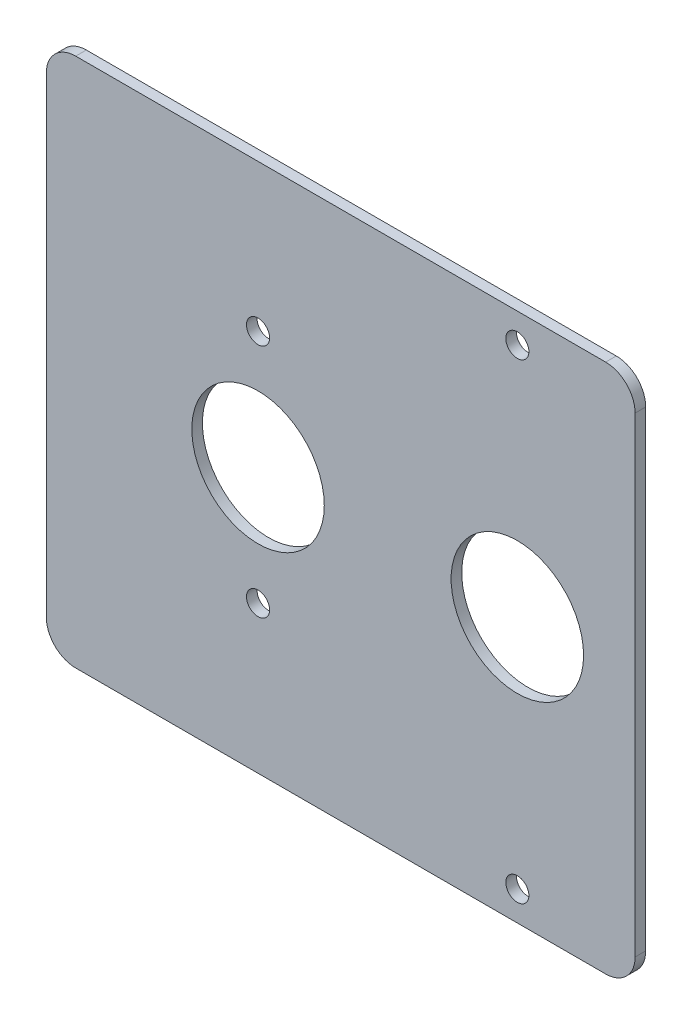
ISO-10303-21;
HEADER;
FILE_DESCRIPTION(('STEP AP214'),'2;1');
FILE_NAME('part.step','',(''),(''),'','','');
FILE_SCHEMA(('AUTOMOTIVE_DESIGN { 1 0 10303 214 1 1 1 1 }'));
ENDSEC;
DATA;
#1=APPLICATION_CONTEXT('core data for automotive mechanical design processes');
#2=APPLICATION_PROTOCOL_DEFINITION('international standard','automotive_design',2000,#1);
#3=PRODUCT_CONTEXT('',#1,'mechanical');
#4=PRODUCT('Part','Part','',(#3));
#5=PRODUCT_RELATED_PRODUCT_CATEGORY('part','',(#4));
#6=PRODUCT_DEFINITION_FORMATION('','',#4);
#7=PRODUCT_DEFINITION_CONTEXT('part definition',#1,'design');
#8=PRODUCT_DEFINITION('design','',#6,#7);
#9=PRODUCT_DEFINITION_SHAPE('','',#8);
#10=(LENGTH_UNIT() NAMED_UNIT(*) SI_UNIT(.MILLI.,.METRE.));
#11=(NAMED_UNIT(*) PLANE_ANGLE_UNIT() SI_UNIT($,.RADIAN.));
#12=(NAMED_UNIT(*) SI_UNIT($,.STERADIAN.) SOLID_ANGLE_UNIT());
#13=UNCERTAINTY_MEASURE_WITH_UNIT(LENGTH_MEASURE(1.E-05),#10,'distance_accuracy_value','');
#14=(GEOMETRIC_REPRESENTATION_CONTEXT(3) GLOBAL_UNCERTAINTY_ASSIGNED_CONTEXT((#13)) GLOBAL_UNIT_ASSIGNED_CONTEXT((#10,
#11,#12)) REPRESENTATION_CONTEXT('',''));
#15=CARTESIAN_POINT('',(0.,0.,0.));
#16=DIRECTION('',(0.,0.,1.));
#17=DIRECTION('',(1.,0.,0.));
#18=AXIS2_PLACEMENT_3D('',#15,#16,#17);
#19=CARTESIAN_POINT('',(0.,0.,1.143));
#20=DIRECTION('',(0.,0.,-1.));
#21=DIRECTION('',(-1.,0.,0.));
#22=AXIS2_PLACEMENT_3D('',#19,#20,#21);
#23=PLANE('',#22);
#24=CARTESIAN_POINT('',(101.6,57.15,1.143));
#25=DIRECTION('',(0.,0.,1.));
#26=DIRECTION('',(1.,0.,0.));
#27=AXIS2_PLACEMENT_3D('',#24,#25,#26);
#28=CIRCLE('',#27,14.2875);
#29=CARTESIAN_POINT('',(115.8875,57.15,1.143));
#30=VERTEX_POINT('',#29);
#31=EDGE_CURVE('E195',#30,#30,#28,.T.);
#32=ORIENTED_EDGE('',*,*,#31,.F.);
#33=EDGE_LOOP('',(#32));
#34=FACE_BOUND('',#33,.T.);
#35=CARTESIAN_POINT('',(45.6692,31.75,1.143));
#36=DIRECTION('',(0.,0.,1.));
#37=DIRECTION('',(1.,0.,0.));
#38=AXIS2_PLACEMENT_3D('',#35,#36,#37);
#39=CIRCLE('',#38,2.4892);
#40=CARTESIAN_POINT('',(48.1584,31.75,1.143));
#41=VERTEX_POINT('',#40);
#42=EDGE_CURVE('E183',#41,#41,#39,.T.);
#43=ORIENTED_EDGE('',*,*,#42,.F.);
#44=EDGE_LOOP('',(#43));
#45=FACE_BOUND('',#44,.T.);
#46=CARTESIAN_POINT('',(45.6692,82.55,1.143));
#47=DIRECTION('',(0.,0.,1.));
#48=DIRECTION('',(1.,0.,0.));
#49=AXIS2_PLACEMENT_3D('',#46,#47,#48);
#50=CIRCLE('',#49,2.4892);
#51=CARTESIAN_POINT('',(48.1584,82.55,1.143));
#52=VERTEX_POINT('',#51);
#53=EDGE_CURVE('E166',#52,#52,#50,.T.);
#54=ORIENTED_EDGE('',*,*,#53,.F.);
#55=EDGE_LOOP('',(#54));
#56=FACE_BOUND('',#55,.T.);
#57=DIRECTION('',(0.,1.,0.));
#58=VECTOR('',#57,1.);
#59=CARTESIAN_POINT('',(127.,0.,1.143));
#60=LINE('',#59,#58);
#61=CARTESIAN_POINT('',(127.,6.35,1.143));
#62=VERTEX_POINT('',#61);
#63=CARTESIAN_POINT('',(127.,107.95,1.143));
#64=VERTEX_POINT('',#63);
#65=EDGE_CURVE('E173',#62,#64,#60,.T.);
#66=ORIENTED_EDGE('',*,*,#65,.T.);
#67=CARTESIAN_POINT('',(120.65,107.95,1.143));
#68=DIRECTION('',(0.,0.,-1.));
#69=DIRECTION('',(-1.,0.,0.));
#70=AXIS2_PLACEMENT_3D('',#67,#68,#69);
#71=CIRCLE('',#70,6.35);
#72=CARTESIAN_POINT('',(120.65,114.3,1.143));
#73=VERTEX_POINT('',#72);
#74=EDGE_CURVE('E150',#64,#73,#71,.F.);
#75=ORIENTED_EDGE('',*,*,#74,.T.);
#76=DIRECTION('',(-1.,0.,0.));
#77=VECTOR('',#76,1.);
#78=CARTESIAN_POINT('',(0.,114.3,1.143));
#79=LINE('',#78,#77);
#80=CARTESIAN_POINT('',(6.35,114.3,1.143));
#81=VERTEX_POINT('',#80);
#82=EDGE_CURVE('E121',#73,#81,#79,.T.);
#83=ORIENTED_EDGE('',*,*,#82,.T.);
#84=CARTESIAN_POINT('',(6.35,107.95,1.143));
#85=DIRECTION('',(0.,0.,-1.));
#86=DIRECTION('',(-1.,0.,0.));
#87=AXIS2_PLACEMENT_3D('',#84,#85,#86);
#88=CIRCLE('',#87,6.35);
#89=CARTESIAN_POINT('',(0.,107.95,1.143));
#90=VERTEX_POINT('',#89);
#91=EDGE_CURVE('E145',#81,#90,#88,.F.);
#92=ORIENTED_EDGE('',*,*,#91,.T.);
#93=DIRECTION('',(0.,-1.,0.));
#94=VECTOR('',#93,1.);
#95=CARTESIAN_POINT('',(0.,0.,1.143));
#96=LINE('',#95,#94);
#97=CARTESIAN_POINT('',(0.,6.35,1.143));
#98=VERTEX_POINT('',#97);
#99=EDGE_CURVE('E128',#90,#98,#96,.T.);
#100=ORIENTED_EDGE('',*,*,#99,.T.);
#101=CARTESIAN_POINT('',(6.35,6.35,1.143));
#102=DIRECTION('',(0.,0.,-1.));
#103=DIRECTION('',(-1.,0.,0.));
#104=AXIS2_PLACEMENT_3D('',#101,#102,#103);
#105=CIRCLE('',#104,6.35);
#106=CARTESIAN_POINT('',(6.35,0.,1.143));
#107=VERTEX_POINT('',#106);
#108=EDGE_CURVE('E57',#98,#107,#105,.F.);
#109=ORIENTED_EDGE('',*,*,#108,.T.);
#110=DIRECTION('',(1.,0.,0.));
#111=VECTOR('',#110,1.);
#112=CARTESIAN_POINT('',(0.,0.,1.143));
#113=LINE('',#112,#111);
#114=CARTESIAN_POINT('',(120.65,0.,1.143));
#115=VERTEX_POINT('',#114);
#116=EDGE_CURVE('E131',#107,#115,#113,.T.);
#117=ORIENTED_EDGE('',*,*,#116,.T.);
#118=CARTESIAN_POINT('',(120.65,6.35,1.143));
#119=DIRECTION('',(0.,0.,-1.));
#120=DIRECTION('',(-1.,0.,0.));
#121=AXIS2_PLACEMENT_3D('',#118,#119,#120);
#122=CIRCLE('',#121,6.35);
#123=EDGE_CURVE('E148',#115,#62,#122,.F.);
#124=ORIENTED_EDGE('',*,*,#123,.T.);
#125=EDGE_LOOP('',(#66,#75,#83,#92,#100,#109,#117,#124));
#126=FACE_BOUND('',#125,.T.);
#127=CARTESIAN_POINT('',(45.6692,57.15,1.143));
#128=DIRECTION('',(0.,0.,1.));
#129=DIRECTION('',(1.,0.,0.));
#130=AXIS2_PLACEMENT_3D('',#127,#128,#129);
#131=CIRCLE('',#130,14.2875);
#132=CARTESIAN_POINT('',(59.9567,57.15,1.143));
#133=VERTEX_POINT('',#132);
#134=EDGE_CURVE('E178',#133,#133,#131,.T.);
#135=ORIENTED_EDGE('',*,*,#134,.F.);
#136=EDGE_LOOP('',(#135));
#137=FACE_BOUND('',#136,.T.);
#138=CARTESIAN_POINT('',(101.6,107.95,1.143));
#139=DIRECTION('',(0.,0.,1.));
#140=DIRECTION('',(1.,0.,0.));
#141=AXIS2_PLACEMENT_3D('',#138,#139,#140);
#142=CIRCLE('',#141,2.4892);
#143=CARTESIAN_POINT('',(104.0892,107.95,1.143));
#144=VERTEX_POINT('',#143);
#145=EDGE_CURVE('E189',#144,#144,#142,.T.);
#146=ORIENTED_EDGE('',*,*,#145,.F.);
#147=EDGE_LOOP('',(#146));
#148=FACE_BOUND('',#147,.T.);
#149=CARTESIAN_POINT('',(101.6,6.35000000000003,1.143));
#150=DIRECTION('',(0.,0.,1.));
#151=DIRECTION('',(1.,0.,0.));
#152=AXIS2_PLACEMENT_3D('',#149,#150,#151);
#153=CIRCLE('',#152,2.4892);
#154=CARTESIAN_POINT('',(104.0892,6.35000000000003,1.143));
#155=VERTEX_POINT('',#154);
#156=EDGE_CURVE('E201',#155,#155,#153,.T.);
#157=ORIENTED_EDGE('',*,*,#156,.F.);
#158=EDGE_LOOP('',(#157));
#159=FACE_BOUND('',#158,.T.);
#160=ADVANCED_FACE('F35',(#34,#45,#56,#126,#137,#148,#159),#23,.F.);
#161=CARTESIAN_POINT('',(0.,0.,-1.143));
#162=DIRECTION('',(0.,0.,-1.));
#163=DIRECTION('',(-1.,0.,0.));
#164=AXIS2_PLACEMENT_3D('',#161,#162,#163);
#165=PLANE('',#164);
#166=CARTESIAN_POINT('',(101.6,57.15,-1.143));
#167=DIRECTION('',(0.,0.,1.));
#168=DIRECTION('',(1.,0.,0.));
#169=AXIS2_PLACEMENT_3D('',#166,#167,#168);
#170=CIRCLE('',#169,14.2875);
#171=CARTESIAN_POINT('',(115.8875,57.15,-1.143));
#172=VERTEX_POINT('',#171);
#173=EDGE_CURVE('E198',#172,#172,#170,.T.);
#174=ORIENTED_EDGE('',*,*,#173,.T.);
#175=EDGE_LOOP('',(#174));
#176=FACE_BOUND('',#175,.T.);
#177=CARTESIAN_POINT('',(45.6692,31.75,-1.143));
#178=DIRECTION('',(0.,0.,1.));
#179=DIRECTION('',(1.,0.,0.));
#180=AXIS2_PLACEMENT_3D('',#177,#178,#179);
#181=CIRCLE('',#180,2.4892);
#182=CARTESIAN_POINT('',(48.1584,31.75,-1.143));
#183=VERTEX_POINT('',#182);
#184=EDGE_CURVE('E186',#183,#183,#181,.T.);
#185=ORIENTED_EDGE('',*,*,#184,.T.);
#186=EDGE_LOOP('',(#185));
#187=FACE_BOUND('',#186,.T.);
#188=CARTESIAN_POINT('',(45.6692,82.55,-1.143));
#189=DIRECTION('',(0.,0.,1.));
#190=DIRECTION('',(1.,0.,0.));
#191=AXIS2_PLACEMENT_3D('',#188,#189,#190);
#192=CIRCLE('',#191,2.4892);
#193=CARTESIAN_POINT('',(48.1584,82.55,-1.143));
#194=VERTEX_POINT('',#193);
#195=EDGE_CURVE('E169',#194,#194,#192,.T.);
#196=ORIENTED_EDGE('',*,*,#195,.T.);
#197=EDGE_LOOP('',(#196));
#198=FACE_BOUND('',#197,.T.);
#199=DIRECTION('',(-1.,0.,0.));
#200=VECTOR('',#199,1.);
#201=CARTESIAN_POINT('',(0.,114.3,-1.143));
#202=LINE('',#201,#200);
#203=CARTESIAN_POINT('',(120.65,114.3,-1.143));
#204=VERTEX_POINT('',#203);
#205=CARTESIAN_POINT('',(6.35,114.3,-1.143));
#206=VERTEX_POINT('',#205);
#207=EDGE_CURVE('E118',#204,#206,#202,.T.);
#208=ORIENTED_EDGE('',*,*,#207,.F.);
#209=CARTESIAN_POINT('',(120.65,107.95,-1.143));
#210=DIRECTION('',(0.,0.,-1.));
#211=DIRECTION('',(-1.,0.,0.));
#212=AXIS2_PLACEMENT_3D('',#209,#210,#211);
#213=CIRCLE('',#212,6.35);
#214=CARTESIAN_POINT('',(127.,107.95,-1.143));
#215=VERTEX_POINT('',#214);
#216=EDGE_CURVE('E101',#204,#215,#213,.T.);
#217=ORIENTED_EDGE('',*,*,#216,.T.);
#218=DIRECTION('',(0.,1.,0.));
#219=VECTOR('',#218,1.);
#220=CARTESIAN_POINT('',(127.,0.,-1.143));
#221=LINE('',#220,#219);
#222=CARTESIAN_POINT('',(127.,6.35,-1.143));
#223=VERTEX_POINT('',#222);
#224=EDGE_CURVE('E129',#223,#215,#221,.T.);
#225=ORIENTED_EDGE('',*,*,#224,.F.);
#226=CARTESIAN_POINT('',(120.65,6.35,-1.143));
#227=DIRECTION('',(0.,0.,-1.));
#228=DIRECTION('',(-1.,0.,0.));
#229=AXIS2_PLACEMENT_3D('',#226,#227,#228);
#230=CIRCLE('',#229,6.35);
#231=CARTESIAN_POINT('',(120.65,0.,-1.143));
#232=VERTEX_POINT('',#231);
#233=EDGE_CURVE('E112',#223,#232,#230,.T.);
#234=ORIENTED_EDGE('',*,*,#233,.T.);
#235=DIRECTION('',(1.,0.,0.));
#236=VECTOR('',#235,1.);
#237=CARTESIAN_POINT('',(0.,0.,-1.143));
#238=LINE('',#237,#236);
#239=CARTESIAN_POINT('',(6.35,0.,-1.143));
#240=VERTEX_POINT('',#239);
#241=EDGE_CURVE('E133',#240,#232,#238,.T.);
#242=ORIENTED_EDGE('',*,*,#241,.F.);
#243=CARTESIAN_POINT('',(6.35,6.35,-1.143));
#244=DIRECTION('',(0.,0.,-1.));
#245=DIRECTION('',(-1.,0.,0.));
#246=AXIS2_PLACEMENT_3D('',#243,#244,#245);
#247=CIRCLE('',#246,6.35);
#248=CARTESIAN_POINT('',(0.,6.35,-1.143));
#249=VERTEX_POINT('',#248);
#250=EDGE_CURVE('E139',#240,#249,#247,.T.);
#251=ORIENTED_EDGE('',*,*,#250,.T.);
#252=DIRECTION('',(0.,-1.,0.));
#253=VECTOR('',#252,1.);
#254=CARTESIAN_POINT('',(0.,0.,-1.143));
#255=LINE('',#254,#253);
#256=CARTESIAN_POINT('',(0.,107.95,-1.143));
#257=VERTEX_POINT('',#256);
#258=EDGE_CURVE('E161',#257,#249,#255,.T.);
#259=ORIENTED_EDGE('',*,*,#258,.F.);
#260=CARTESIAN_POINT('',(6.35,107.95,-1.143));
#261=DIRECTION('',(0.,0.,-1.));
#262=DIRECTION('',(-1.,0.,0.));
#263=AXIS2_PLACEMENT_3D('',#260,#261,#262);
#264=CIRCLE('',#263,6.35);
#265=EDGE_CURVE('E122',#257,#206,#264,.T.);
#266=ORIENTED_EDGE('',*,*,#265,.T.);
#267=EDGE_LOOP('',(#208,#217,#225,#234,#242,#251,#259,#266));
#268=FACE_BOUND('',#267,.T.);
#269=CARTESIAN_POINT('',(45.6692,57.15,-1.143));
#270=DIRECTION('',(0.,0.,1.));
#271=DIRECTION('',(1.,0.,0.));
#272=AXIS2_PLACEMENT_3D('',#269,#270,#271);
#273=CIRCLE('',#272,14.2875);
#274=CARTESIAN_POINT('',(59.9567,57.15,-1.143));
#275=VERTEX_POINT('',#274);
#276=EDGE_CURVE('E180',#275,#275,#273,.T.);
#277=ORIENTED_EDGE('',*,*,#276,.T.);
#278=EDGE_LOOP('',(#277));
#279=FACE_BOUND('',#278,.T.);
#280=CARTESIAN_POINT('',(101.6,107.95,-1.143));
#281=DIRECTION('',(0.,0.,1.));
#282=DIRECTION('',(1.,0.,0.));
#283=AXIS2_PLACEMENT_3D('',#280,#281,#282);
#284=CIRCLE('',#283,2.4892);
#285=CARTESIAN_POINT('',(104.0892,107.95,-1.143));
#286=VERTEX_POINT('',#285);
#287=EDGE_CURVE('E192',#286,#286,#284,.T.);
#288=ORIENTED_EDGE('',*,*,#287,.T.);
#289=EDGE_LOOP('',(#288));
#290=FACE_BOUND('',#289,.T.);
#291=CARTESIAN_POINT('',(101.6,6.35000000000003,-1.143));
#292=DIRECTION('',(0.,0.,1.));
#293=DIRECTION('',(1.,0.,0.));
#294=AXIS2_PLACEMENT_3D('',#291,#292,#293);
#295=CIRCLE('',#294,2.4892);
#296=CARTESIAN_POINT('',(104.0892,6.35000000000003,-1.143));
#297=VERTEX_POINT('',#296);
#298=EDGE_CURVE('E204',#297,#297,#295,.T.);
#299=ORIENTED_EDGE('',*,*,#298,.T.);
#300=EDGE_LOOP('',(#299));
#301=FACE_BOUND('',#300,.T.);
#302=ADVANCED_FACE('F125',(#176,#187,#198,#268,#279,#290,#301),#165,.T.);
#303=CARTESIAN_POINT('',(0.,0.,1.143));
#304=DIRECTION('',(1.,0.,0.));
#305=DIRECTION('',(0.,0.,-1.));
#306=AXIS2_PLACEMENT_3D('',#303,#304,#305);
#307=PLANE('',#306);
#308=ORIENTED_EDGE('',*,*,#258,.T.);
#309=DIRECTION('',(0.,0.,-1.));
#310=VECTOR('',#309,1.);
#311=CARTESIAN_POINT('',(0.,6.35,1.143));
#312=LINE('',#311,#310);
#313=EDGE_CURVE('E11',#249,#98,#312,.F.);
#314=ORIENTED_EDGE('',*,*,#313,.T.);
#315=ORIENTED_EDGE('',*,*,#99,.F.);
#316=DIRECTION('',(0.,0.,-1.));
#317=VECTOR('',#316,1.);
#318=CARTESIAN_POINT('',(0.,107.95,1.143));
#319=LINE('',#318,#317);
#320=EDGE_CURVE('E43',#90,#257,#319,.T.);
#321=ORIENTED_EDGE('',*,*,#320,.T.);
#322=EDGE_LOOP('',(#308,#314,#315,#321));
#323=FACE_BOUND('',#322,.T.);
#324=ADVANCED_FACE('F160',(#323),#307,.F.);
#325=CARTESIAN_POINT('',(0.,0.,1.143));
#326=DIRECTION('',(0.,1.,0.));
#327=DIRECTION('',(0.,0.,1.));
#328=AXIS2_PLACEMENT_3D('',#325,#326,#327);
#329=PLANE('',#328);
#330=ORIENTED_EDGE('',*,*,#241,.T.);
#331=DIRECTION('',(0.,0.,-1.));
#332=VECTOR('',#331,1.);
#333=CARTESIAN_POINT('',(120.65,0.,1.143));
#334=LINE('',#333,#332);
#335=EDGE_CURVE('E50',#232,#115,#334,.F.);
#336=ORIENTED_EDGE('',*,*,#335,.T.);
#337=ORIENTED_EDGE('',*,*,#116,.F.);
#338=DIRECTION('',(0.,0.,-1.));
#339=VECTOR('',#338,1.);
#340=CARTESIAN_POINT('',(6.35,0.,1.143));
#341=LINE('',#340,#339);
#342=EDGE_CURVE('E152',#107,#240,#341,.T.);
#343=ORIENTED_EDGE('',*,*,#342,.T.);
#344=EDGE_LOOP('',(#330,#336,#337,#343));
#345=FACE_BOUND('',#344,.T.);
#346=ADVANCED_FACE('F232',(#345),#329,.F.);
#347=CARTESIAN_POINT('',(127.,0.,1.143));
#348=DIRECTION('',(-1.,0.,0.));
#349=DIRECTION('',(0.,0.,1.));
#350=AXIS2_PLACEMENT_3D('',#347,#348,#349);
#351=PLANE('',#350);
#352=ORIENTED_EDGE('',*,*,#224,.T.);
#353=DIRECTION('',(0.,0.,-1.));
#354=VECTOR('',#353,1.);
#355=CARTESIAN_POINT('',(127.,107.95,1.143));
#356=LINE('',#355,#354);
#357=EDGE_CURVE('E106',#215,#64,#356,.F.);
#358=ORIENTED_EDGE('',*,*,#357,.T.);
#359=ORIENTED_EDGE('',*,*,#65,.F.);
#360=DIRECTION('',(0.,0.,-1.));
#361=VECTOR('',#360,1.);
#362=CARTESIAN_POINT('',(127.,6.35,1.143));
#363=LINE('',#362,#361);
#364=EDGE_CURVE('E111',#62,#223,#363,.T.);
#365=ORIENTED_EDGE('',*,*,#364,.T.);
#366=EDGE_LOOP('',(#352,#358,#359,#365));
#367=FACE_BOUND('',#366,.T.);
#368=ADVANCED_FACE('F229',(#367),#351,.F.);
#369=CARTESIAN_POINT('',(0.,114.3,1.143));
#370=DIRECTION('',(0.,-1.,0.));
#371=DIRECTION('',(0.,0.,-1.));
#372=AXIS2_PLACEMENT_3D('',#369,#370,#371);
#373=PLANE('',#372);
#374=ORIENTED_EDGE('',*,*,#82,.F.);
#375=DIRECTION('',(0.,0.,-1.));
#376=VECTOR('',#375,1.);
#377=CARTESIAN_POINT('',(120.65,114.3,1.143));
#378=LINE('',#377,#376);
#379=EDGE_CURVE('E105',#73,#204,#378,.T.);
#380=ORIENTED_EDGE('',*,*,#379,.T.);
#381=ORIENTED_EDGE('',*,*,#207,.T.);
#382=DIRECTION('',(0.,0.,-1.));
#383=VECTOR('',#382,1.);
#384=CARTESIAN_POINT('',(6.35,114.3,1.143));
#385=LINE('',#384,#383);
#386=EDGE_CURVE('E123',#206,#81,#385,.F.);
#387=ORIENTED_EDGE('',*,*,#386,.T.);
#388=EDGE_LOOP('',(#374,#380,#381,#387));
#389=FACE_BOUND('',#388,.T.);
#390=ADVANCED_FACE('F117',(#389),#373,.F.);
#391=CARTESIAN_POINT('',(45.6692,82.55,1.143));
#392=DIRECTION('',(0.,0.,-1.));
#393=DIRECTION('',(-1.,0.,0.));
#394=AXIS2_PLACEMENT_3D('',#391,#392,#393);
#395=CYLINDRICAL_SURFACE('',#394,2.4892);
#396=ORIENTED_EDGE('',*,*,#53,.T.);
#397=EDGE_LOOP('',(#396));
#398=FACE_BOUND('',#397,.T.);
#399=ORIENTED_EDGE('',*,*,#195,.F.);
#400=EDGE_LOOP('',(#399));
#401=FACE_BOUND('',#400,.T.);
#402=ADVANCED_FACE('F224',(#398,#401),#395,.F.);
#403=CARTESIAN_POINT('',(45.6692,57.15,1.143));
#404=DIRECTION('',(0.,0.,-1.));
#405=DIRECTION('',(-1.,0.,0.));
#406=AXIS2_PLACEMENT_3D('',#403,#404,#405);
#407=CYLINDRICAL_SURFACE('',#406,14.2875);
#408=ORIENTED_EDGE('',*,*,#134,.T.);
#409=EDGE_LOOP('',(#408));
#410=FACE_BOUND('',#409,.T.);
#411=ORIENTED_EDGE('',*,*,#276,.F.);
#412=EDGE_LOOP('',(#411));
#413=FACE_BOUND('',#412,.T.);
#414=ADVANCED_FACE('F277',(#410,#413),#407,.F.);
#415=CARTESIAN_POINT('',(45.6692,31.75,1.143));
#416=DIRECTION('',(0.,0.,-1.));
#417=DIRECTION('',(-1.,0.,0.));
#418=AXIS2_PLACEMENT_3D('',#415,#416,#417);
#419=CYLINDRICAL_SURFACE('',#418,2.4892);
#420=ORIENTED_EDGE('',*,*,#42,.T.);
#421=EDGE_LOOP('',(#420));
#422=FACE_BOUND('',#421,.T.);
#423=ORIENTED_EDGE('',*,*,#184,.F.);
#424=EDGE_LOOP('',(#423));
#425=FACE_BOUND('',#424,.T.);
#426=ADVANCED_FACE('F262',(#422,#425),#419,.F.);
#427=CARTESIAN_POINT('',(101.6,107.95,1.143));
#428=DIRECTION('',(0.,0.,-1.));
#429=DIRECTION('',(-1.,0.,0.));
#430=AXIS2_PLACEMENT_3D('',#427,#428,#429);
#431=CYLINDRICAL_SURFACE('',#430,2.4892);
#432=ORIENTED_EDGE('',*,*,#145,.T.);
#433=EDGE_LOOP('',(#432));
#434=FACE_BOUND('',#433,.T.);
#435=ORIENTED_EDGE('',*,*,#287,.F.);
#436=EDGE_LOOP('',(#435));
#437=FACE_BOUND('',#436,.T.);
#438=ADVANCED_FACE('F258',(#434,#437),#431,.F.);
#439=CARTESIAN_POINT('',(101.6,57.15,1.143));
#440=DIRECTION('',(0.,0.,-1.));
#441=DIRECTION('',(-1.,0.,0.));
#442=AXIS2_PLACEMENT_3D('',#439,#440,#441);
#443=CYLINDRICAL_SURFACE('',#442,14.2875);
#444=ORIENTED_EDGE('',*,*,#31,.T.);
#445=EDGE_LOOP('',(#444));
#446=FACE_BOUND('',#445,.T.);
#447=ORIENTED_EDGE('',*,*,#173,.F.);
#448=EDGE_LOOP('',(#447));
#449=FACE_BOUND('',#448,.T.);
#450=ADVANCED_FACE('F261',(#446,#449),#443,.F.);
#451=CARTESIAN_POINT('',(101.6,6.35000000000003,1.143));
#452=DIRECTION('',(0.,0.,-1.));
#453=DIRECTION('',(-1.,0.,0.));
#454=AXIS2_PLACEMENT_3D('',#451,#452,#453);
#455=CYLINDRICAL_SURFACE('',#454,2.4892);
#456=ORIENTED_EDGE('',*,*,#156,.T.);
#457=EDGE_LOOP('',(#456));
#458=FACE_BOUND('',#457,.T.);
#459=ORIENTED_EDGE('',*,*,#298,.F.);
#460=EDGE_LOOP('',(#459));
#461=FACE_BOUND('',#460,.T.);
#462=ADVANCED_FACE('F210',(#458,#461),#455,.F.);
#463=CARTESIAN_POINT('',(120.65,107.95,1.143));
#464=DIRECTION('',(0.,0.,-1.));
#465=DIRECTION('',(-1.,0.,0.));
#466=AXIS2_PLACEMENT_3D('',#463,#464,#465);
#467=CYLINDRICAL_SURFACE('',#466,6.35);
#468=ORIENTED_EDGE('',*,*,#74,.F.);
#469=ORIENTED_EDGE('',*,*,#357,.F.);
#470=ORIENTED_EDGE('',*,*,#216,.F.);
#471=ORIENTED_EDGE('',*,*,#379,.F.);
#472=EDGE_LOOP('',(#468,#469,#470,#471));
#473=FACE_BOUND('',#472,.T.);
#474=ADVANCED_FACE('F104',(#473),#467,.T.);
#475=CARTESIAN_POINT('',(120.65,6.35,1.143));
#476=DIRECTION('',(0.,0.,-1.));
#477=DIRECTION('',(-1.,0.,0.));
#478=AXIS2_PLACEMENT_3D('',#475,#476,#477);
#479=CYLINDRICAL_SURFACE('',#478,6.35);
#480=ORIENTED_EDGE('',*,*,#123,.F.);
#481=ORIENTED_EDGE('',*,*,#335,.F.);
#482=ORIENTED_EDGE('',*,*,#233,.F.);
#483=ORIENTED_EDGE('',*,*,#364,.F.);
#484=EDGE_LOOP('',(#480,#481,#482,#483));
#485=FACE_BOUND('',#484,.T.);
#486=ADVANCED_FACE('F240',(#485),#479,.T.);
#487=CARTESIAN_POINT('',(6.35,6.35,1.143));
#488=DIRECTION('',(0.,0.,-1.));
#489=DIRECTION('',(-1.,0.,0.));
#490=AXIS2_PLACEMENT_3D('',#487,#488,#489);
#491=CYLINDRICAL_SURFACE('',#490,6.35);
#492=ORIENTED_EDGE('',*,*,#108,.F.);
#493=ORIENTED_EDGE('',*,*,#313,.F.);
#494=ORIENTED_EDGE('',*,*,#250,.F.);
#495=ORIENTED_EDGE('',*,*,#342,.F.);
#496=EDGE_LOOP('',(#492,#493,#494,#495));
#497=FACE_BOUND('',#496,.T.);
#498=ADVANCED_FACE('F242',(#497),#491,.T.);
#499=CARTESIAN_POINT('',(6.35,107.95,1.143));
#500=DIRECTION('',(0.,0.,-1.));
#501=DIRECTION('',(-1.,0.,0.));
#502=AXIS2_PLACEMENT_3D('',#499,#500,#501);
#503=CYLINDRICAL_SURFACE('',#502,6.35);
#504=ORIENTED_EDGE('',*,*,#91,.F.);
#505=ORIENTED_EDGE('',*,*,#386,.F.);
#506=ORIENTED_EDGE('',*,*,#265,.F.);
#507=ORIENTED_EDGE('',*,*,#320,.F.);
#508=EDGE_LOOP('',(#504,#505,#506,#507));
#509=FACE_BOUND('',#508,.T.);
#510=ADVANCED_FACE('F37',(#509),#503,.T.);
#511=CLOSED_SHELL('',(#160,#302,#324,#346,#368,#390,#402,#414,#426,#438,#450,#462,#474,#486,
#498,#510));
#512=MANIFOLD_SOLID_BREP('B2',#511);
#513=ADVANCED_BREP_SHAPE_REPRESENTATION('',(#18,#512),#14);
#514=SHAPE_DEFINITION_REPRESENTATION(#9,#513);
ENDSEC;
END-ISO-10303-21;
